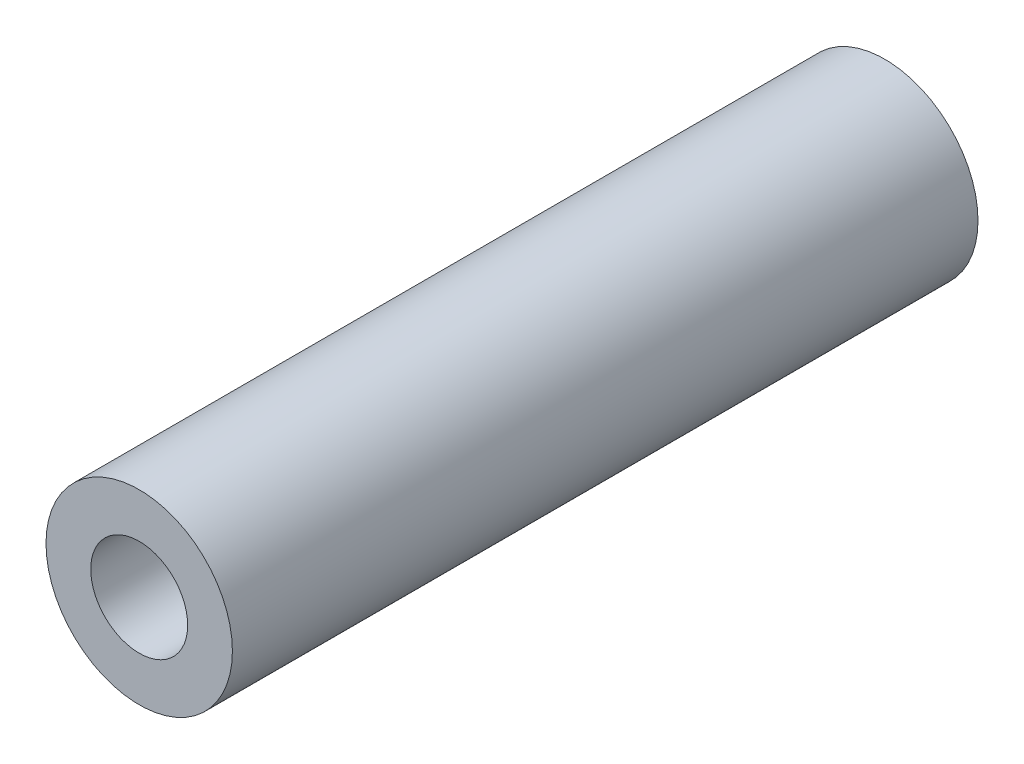
ISO-10303-21;
HEADER;
FILE_DESCRIPTION(('STEP AP214'),'2;1');
FILE_NAME('part.step','',(''),(''),'','','');
FILE_SCHEMA(('AUTOMOTIVE_DESIGN { 1 0 10303 214 1 1 1 1 }'));
ENDSEC;
DATA;
#1=APPLICATION_CONTEXT('core data for automotive mechanical design processes');
#2=APPLICATION_PROTOCOL_DEFINITION('international standard','automotive_design',2000,#1);
#3=PRODUCT_CONTEXT('',#1,'mechanical');
#4=PRODUCT('Part','Part','',(#3));
#5=PRODUCT_RELATED_PRODUCT_CATEGORY('part','',(#4));
#6=PRODUCT_DEFINITION_FORMATION('','',#4);
#7=PRODUCT_DEFINITION_CONTEXT('part definition',#1,'design');
#8=PRODUCT_DEFINITION('design','',#6,#7);
#9=PRODUCT_DEFINITION_SHAPE('','',#8);
#10=(LENGTH_UNIT() NAMED_UNIT(*) SI_UNIT(.MILLI.,.METRE.));
#11=(NAMED_UNIT(*) PLANE_ANGLE_UNIT() SI_UNIT($,.RADIAN.));
#12=(NAMED_UNIT(*) SI_UNIT($,.STERADIAN.) SOLID_ANGLE_UNIT());
#13=UNCERTAINTY_MEASURE_WITH_UNIT(LENGTH_MEASURE(1.E-05),#10,'distance_accuracy_value','');
#14=(GEOMETRIC_REPRESENTATION_CONTEXT(3) GLOBAL_UNCERTAINTY_ASSIGNED_CONTEXT((#13)) GLOBAL_UNIT_ASSIGNED_CONTEXT((#10,
#11,#12)) REPRESENTATION_CONTEXT('',''));
#15=CARTESIAN_POINT('',(0.,0.,0.));
#16=DIRECTION('',(0.,0.,1.));
#17=DIRECTION('',(1.,0.,0.));
#18=AXIS2_PLACEMENT_3D('',#15,#16,#17);
#19=CARTESIAN_POINT('',(0.,0.,50.8));
#20=DIRECTION('',(0.,0.,1.));
#21=DIRECTION('',(1.,0.,0.));
#22=AXIS2_PLACEMENT_3D('',#19,#20,#21);
#23=PLANE('',#22);
#24=CARTESIAN_POINT('',(0.,0.,50.8));
#25=DIRECTION('',(0.,0.,1.));
#26=DIRECTION('',(1.,0.,0.));
#27=AXIS2_PLACEMENT_3D('',#24,#25,#26);
#28=CIRCLE('',#27,6.35);
#29=CARTESIAN_POINT('',(6.35,0.,50.8));
#30=VERTEX_POINT('',#29);
#31=EDGE_CURVE('E10',#30,#30,#28,.T.);
#32=ORIENTED_EDGE('',*,*,#31,.T.);
#33=EDGE_LOOP('',(#32));
#34=FACE_BOUND('',#33,.T.);
#35=CARTESIAN_POINT('',(0.,0.,50.8));
#36=DIRECTION('',(0.,0.,1.));
#37=DIRECTION('',(1.,0.,0.));
#38=AXIS2_PLACEMENT_3D('',#35,#36,#37);
#39=CIRCLE('',#38,3.302);
#40=CARTESIAN_POINT('',(3.302,0.,50.8));
#41=VERTEX_POINT('',#40);
#42=EDGE_CURVE('E46',#41,#41,#39,.T.);
#43=ORIENTED_EDGE('',*,*,#42,.F.);
#44=EDGE_LOOP('',(#43));
#45=FACE_BOUND('',#44,.T.);
#46=ADVANCED_FACE('F35',(#34,#45),#23,.T.);
#47=CARTESIAN_POINT('',(0.,0.,0.));
#48=DIRECTION('',(0.,0.,1.));
#49=DIRECTION('',(1.,0.,0.));
#50=AXIS2_PLACEMENT_3D('',#47,#48,#49);
#51=PLANE('',#50);
#52=CARTESIAN_POINT('',(0.,0.,0.));
#53=DIRECTION('',(0.,0.,1.));
#54=DIRECTION('',(1.,0.,0.));
#55=AXIS2_PLACEMENT_3D('',#52,#53,#54);
#56=CIRCLE('',#55,6.35);
#57=CARTESIAN_POINT('',(6.35,0.,0.));
#58=VERTEX_POINT('',#57);
#59=EDGE_CURVE('E39',#58,#58,#56,.T.);
#60=ORIENTED_EDGE('',*,*,#59,.F.);
#61=EDGE_LOOP('',(#60));
#62=FACE_BOUND('',#61,.T.);
#63=CARTESIAN_POINT('',(0.,0.,0.));
#64=DIRECTION('',(0.,0.,1.));
#65=DIRECTION('',(1.,0.,0.));
#66=AXIS2_PLACEMENT_3D('',#63,#64,#65);
#67=CIRCLE('',#66,3.302);
#68=CARTESIAN_POINT('',(3.302,0.,0.));
#69=VERTEX_POINT('',#68);
#70=EDGE_CURVE('E48',#69,#69,#67,.T.);
#71=ORIENTED_EDGE('',*,*,#70,.T.);
#72=EDGE_LOOP('',(#71));
#73=FACE_BOUND('',#72,.T.);
#74=ADVANCED_FACE('F58',(#62,#73),#51,.F.);
#75=CARTESIAN_POINT('',(0.,0.,50.8));
#76=DIRECTION('',(0.,0.,-1.));
#77=DIRECTION('',(-1.,0.,0.));
#78=AXIS2_PLACEMENT_3D('',#75,#76,#77);
#79=CYLINDRICAL_SURFACE('',#78,6.35);
#80=ORIENTED_EDGE('',*,*,#31,.F.);
#81=EDGE_LOOP('',(#80));
#82=FACE_BOUND('',#81,.T.);
#83=ORIENTED_EDGE('',*,*,#59,.T.);
#84=EDGE_LOOP('',(#83));
#85=FACE_BOUND('',#84,.T.);
#86=ADVANCED_FACE('F37',(#82,#85),#79,.T.);
#87=CARTESIAN_POINT('',(0.,0.,50.8));
#88=DIRECTION('',(0.,0.,-1.));
#89=DIRECTION('',(-1.,0.,0.));
#90=AXIS2_PLACEMENT_3D('',#87,#88,#89);
#91=CYLINDRICAL_SURFACE('',#90,3.302);
#92=ORIENTED_EDGE('',*,*,#42,.T.);
#93=EDGE_LOOP('',(#92));
#94=FACE_BOUND('',#93,.T.);
#95=ORIENTED_EDGE('',*,*,#70,.F.);
#96=EDGE_LOOP('',(#95));
#97=FACE_BOUND('',#96,.T.);
#98=ADVANCED_FACE('F54',(#94,#97),#91,.F.);
#99=CLOSED_SHELL('',(#46,#74,#86,#98));
#100=MANIFOLD_SOLID_BREP('B2',#99);
#101=ADVANCED_BREP_SHAPE_REPRESENTATION('',(#18,#100),#14);
#102=SHAPE_DEFINITION_REPRESENTATION(#9,#101);
ENDSEC;
END-ISO-10303-21;
